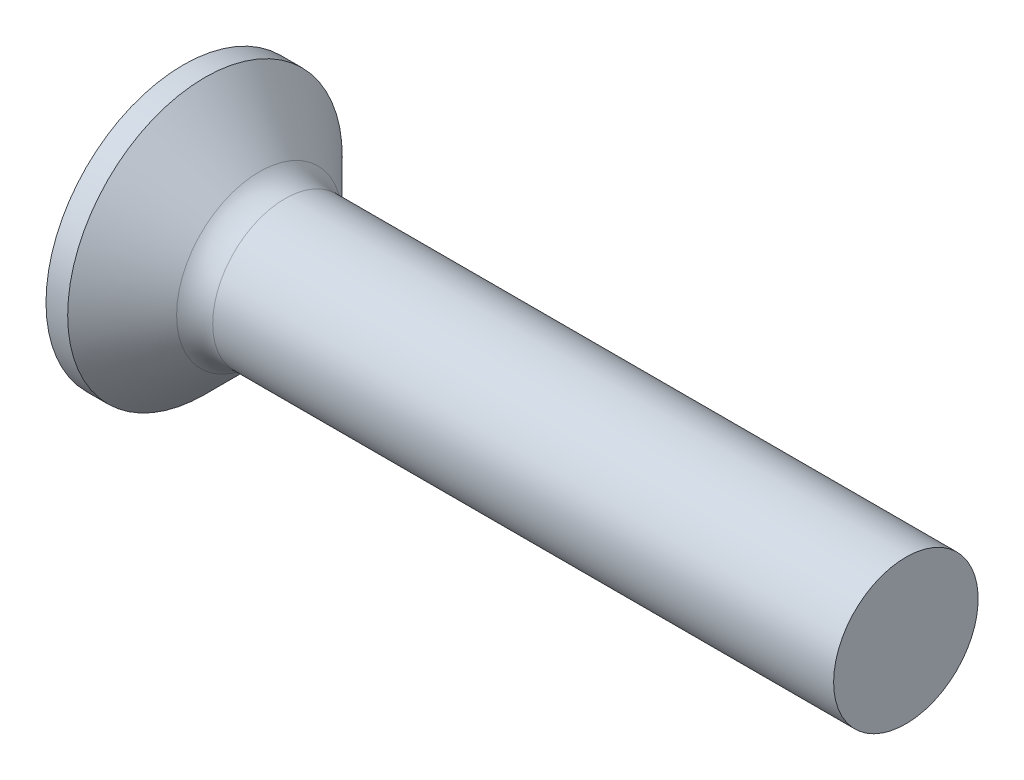
ISO-10303-21;
HEADER;
FILE_DESCRIPTION(('STEP AP214'),'2;1');
FILE_NAME('part.step','',(''),(''),'','','');
FILE_SCHEMA(('AUTOMOTIVE_DESIGN { 1 0 10303 214 1 1 1 1 }'));
ENDSEC;
DATA;
#1=APPLICATION_CONTEXT('core data for automotive mechanical design processes');
#2=APPLICATION_PROTOCOL_DEFINITION('international standard','automotive_design',2000,#1);
#3=PRODUCT_CONTEXT('',#1,'mechanical');
#4=PRODUCT('Part','Part','',(#3));
#5=PRODUCT_RELATED_PRODUCT_CATEGORY('part','',(#4));
#6=PRODUCT_DEFINITION_FORMATION('','',#4);
#7=PRODUCT_DEFINITION_CONTEXT('part definition',#1,'design');
#8=PRODUCT_DEFINITION('design','',#6,#7);
#9=PRODUCT_DEFINITION_SHAPE('','',#8);
#10=(LENGTH_UNIT() NAMED_UNIT(*) SI_UNIT(.MILLI.,.METRE.));
#11=(NAMED_UNIT(*) PLANE_ANGLE_UNIT() SI_UNIT($,.RADIAN.));
#12=(NAMED_UNIT(*) SI_UNIT($,.STERADIAN.) SOLID_ANGLE_UNIT());
#13=UNCERTAINTY_MEASURE_WITH_UNIT(LENGTH_MEASURE(1.E-05),#10,'distance_accuracy_value','');
#14=(GEOMETRIC_REPRESENTATION_CONTEXT(3) GLOBAL_UNCERTAINTY_ASSIGNED_CONTEXT((#13)) GLOBAL_UNIT_ASSIGNED_CONTEXT((#10,
#11,#12)) REPRESENTATION_CONTEXT('',''));
#15=CARTESIAN_POINT('',(0.,0.,0.));
#16=DIRECTION('',(0.,0.,1.));
#17=DIRECTION('',(1.,0.,0.));
#18=AXIS2_PLACEMENT_3D('',#15,#16,#17);
#19=CARTESIAN_POINT('',(0.,0.,0.));
#20=DIRECTION('',(-1.,0.,0.));
#21=DIRECTION('',(0.,0.,1.));
#22=AXIS2_PLACEMENT_3D('',#19,#20,#21);
#23=PLANE('',#22);
#24=CARTESIAN_POINT('',(0.,0.,0.));
#25=DIRECTION('',(-1.,0.,0.));
#26=DIRECTION('',(0.,0.,1.));
#27=AXIS2_PLACEMENT_3D('',#24,#25,#26);
#28=CIRCLE('',#27,1.9);
#29=CARTESIAN_POINT('',(0.,0.,1.9));
#30=VERTEX_POINT('',#29);
#31=EDGE_CURVE('E342',#30,#30,#28,.T.);
#32=ORIENTED_EDGE('',*,*,#31,.T.);
#33=EDGE_LOOP('',(#32));
#34=FACE_BOUND('',#33,.T.);
#35=DIRECTION('',(0.,0.,-1.));
#36=VECTOR('',#35,1.);
#37=CARTESIAN_POINT('',(0.,-0.240000000000003,0.949999999999999));
#38=LINE('',#37,#36);
#39=CARTESIAN_POINT('',(0.,-0.240000000000003,0.949999999999999));
#40=VERTEX_POINT('',#39);
#41=CARTESIAN_POINT('',(0.,-0.240000000000001,0.368080234393745));
#42=VERTEX_POINT('',#41);
#43=EDGE_CURVE('E381',#40,#42,#38,.T.);
#44=ORIENTED_EDGE('',*,*,#43,.T.);
#45=CARTESIAN_POINT('',(0.,0.,0.));
#46=DIRECTION('',(-1.,0.,0.));
#47=DIRECTION('',(0.,0.,1.));
#48=AXIS2_PLACEMENT_3D('',#45,#46,#47);
#49=CIRCLE('',#48,0.439412174332203);
#50=CARTESIAN_POINT('',(0.,-0.368080234393745,0.24));
#51=VERTEX_POINT('',#50);
#52=EDGE_CURVE('E368',#51,#42,#49,.T.);
#53=ORIENTED_EDGE('',*,*,#52,.F.);
#54=DIRECTION('',(0.,-1.,0.));
#55=VECTOR('',#54,1.);
#56=CARTESIAN_POINT('',(0.,0.95,0.24));
#57=LINE('',#56,#55);
#58=CARTESIAN_POINT('',(0.,-0.95,0.24));
#59=VERTEX_POINT('',#58);
#60=EDGE_CURVE('E428',#51,#59,#57,.T.);
#61=ORIENTED_EDGE('',*,*,#60,.T.);
#62=DIRECTION('',(0.,0.,-1.));
#63=VECTOR('',#62,1.);
#64=CARTESIAN_POINT('',(0.,-0.95,0.24));
#65=LINE('',#64,#63);
#66=CARTESIAN_POINT('',(0.,-0.95,-0.24));
#67=VERTEX_POINT('',#66);
#68=EDGE_CURVE('E339',#59,#67,#65,.T.);
#69=ORIENTED_EDGE('',*,*,#68,.T.);
#70=DIRECTION('',(0.,1.,0.));
#71=VECTOR('',#70,1.);
#72=CARTESIAN_POINT('',(0.,-0.95,-0.24));
#73=LINE('',#72,#71);
#74=CARTESIAN_POINT('',(0.,-0.368080234393745,-0.24));
#75=VERTEX_POINT('',#74);
#76=EDGE_CURVE('E429',#67,#75,#73,.T.);
#77=ORIENTED_EDGE('',*,*,#76,.T.);
#78=CARTESIAN_POINT('',(0.,-0.239999999999999,-0.368080234393746));
#79=VERTEX_POINT('',#78);
#80=EDGE_CURVE('E374',#79,#75,#49,.T.);
#81=ORIENTED_EDGE('',*,*,#80,.F.);
#82=CARTESIAN_POINT('',(0.,-0.239999999999997,-0.950000000000001));
#83=VERTEX_POINT('',#82);
#84=EDGE_CURVE('E390',#79,#83,#38,.T.);
#85=ORIENTED_EDGE('',*,*,#84,.T.);
#86=DIRECTION('',(0.,1.,0.));
#87=VECTOR('',#86,1.);
#88=CARTESIAN_POINT('',(0.,-0.239999999999997,-0.950000000000001));
#89=LINE('',#88,#87);
#90=CARTESIAN_POINT('',(0.,0.240000000000003,-0.949999999999999));
#91=VERTEX_POINT('',#90);
#92=EDGE_CURVE('E389',#83,#91,#89,.T.);
#93=ORIENTED_EDGE('',*,*,#92,.T.);
#94=DIRECTION('',(0.,0.,1.));
#95=VECTOR('',#94,1.);
#96=CARTESIAN_POINT('',(0.,0.240000000000003,-0.949999999999999));
#97=LINE('',#96,#95);
#98=CARTESIAN_POINT('',(0.,0.240000000000001,-0.368080234393745));
#99=VERTEX_POINT('',#98);
#100=EDGE_CURVE('E396',#91,#99,#97,.T.);
#101=ORIENTED_EDGE('',*,*,#100,.T.);
#102=CARTESIAN_POINT('',(0.,0.368080234393745,-0.24));
#103=VERTEX_POINT('',#102);
#104=EDGE_CURVE('E464',#103,#99,#49,.T.);
#105=ORIENTED_EDGE('',*,*,#104,.F.);
#106=CARTESIAN_POINT('',(0.,0.95,-0.24));
#107=VERTEX_POINT('',#106);
#108=EDGE_CURVE('E437',#103,#107,#73,.T.);
#109=ORIENTED_EDGE('',*,*,#108,.T.);
#110=DIRECTION('',(0.,0.,1.));
#111=VECTOR('',#110,1.);
#112=CARTESIAN_POINT('',(0.,0.95,-0.24));
#113=LINE('',#112,#111);
#114=CARTESIAN_POINT('',(0.,0.95,0.24));
#115=VERTEX_POINT('',#114);
#116=EDGE_CURVE('E425',#107,#115,#113,.T.);
#117=ORIENTED_EDGE('',*,*,#116,.T.);
#118=CARTESIAN_POINT('',(0.,0.368080234393745,0.24));
#119=VERTEX_POINT('',#118);
#120=EDGE_CURVE('E430',#115,#119,#57,.T.);
#121=ORIENTED_EDGE('',*,*,#120,.T.);
#122=CARTESIAN_POINT('',(0.,0.239999999999999,0.368080234393746));
#123=VERTEX_POINT('',#122);
#124=EDGE_CURVE('E376',#123,#119,#49,.T.);
#125=ORIENTED_EDGE('',*,*,#124,.F.);
#126=CARTESIAN_POINT('',(0.,0.239999999999997,0.950000000000001));
#127=VERTEX_POINT('',#126);
#128=EDGE_CURVE('E399',#123,#127,#97,.T.);
#129=ORIENTED_EDGE('',*,*,#128,.T.);
#130=DIRECTION('',(0.,-1.,0.));
#131=VECTOR('',#130,1.);
#132=CARTESIAN_POINT('',(0.,0.239999999999997,0.950000000000001));
#133=LINE('',#132,#131);
#134=EDGE_CURVE('E388',#127,#40,#133,.T.);
#135=ORIENTED_EDGE('',*,*,#134,.T.);
#136=EDGE_LOOP('',(#44,#53,#61,#69,#77,#81,#85,#93,#101,#105,#109,#117,#121,#125,#129,#135));
#137=FACE_BOUND('',#136,.T.);
#138=ADVANCED_FACE('F35',(#34,#137),#23,.T.);
#139=CARTESIAN_POINT('',(0.,-0.949999999999999,0.24));
#140=DIRECTION('',(0.,0.,-1.));
#141=DIRECTION('',(0.,1.,0.));
#142=AXIS2_PLACEMENT_3D('',#139,#140,#141);
#143=PLANE('',#142);
#144=ORIENTED_EDGE('',*,*,#60,.F.);
#145=CARTESIAN_POINT('',(-0.647693210421638,-0.421114336989891,0.24));
#146=CARTESIAN_POINT('',(-0.514503449539821,-0.410390261082994,0.24));
#147=CARTESIAN_POINT('',(-0.381320940230654,-0.399574318210381,0.24));
#148=CARTESIAN_POINT('',(-0.114973765657541,-0.377686644384344,0.24));
#149=CARTESIAN_POINT('',(0.0181908991048064,-0.366614907333785,0.24));
#150=CARTESIAN_POINT('',(0.284492634007954,-0.344144100394554,0.24));
#151=CARTESIAN_POINT('',(0.417629704159725,-0.332745030636282,0.24));
#152=CARTESIAN_POINT('',(0.683863247577946,-0.309504122508032,0.24));
#153=CARTESIAN_POINT('',(0.816959721458451,-0.297662291208049,0.24));
#154=CARTESIAN_POINT('',(1.04303435438055,-0.277010154534468,0.24));
#155=CARTESIAN_POINT('',(1.13602713245196,-0.268360479226193,0.24));
#156=CARTESIAN_POINT('',(1.32197255819723,-0.250648380041589,0.24));
#157=CARTESIAN_POINT('',(1.41492520622595,-0.241585959893612,0.24));
#158=CARTESIAN_POINT('',(1.60078125425266,-0.222904447218474,0.24));
#159=CARTESIAN_POINT('',(1.69368465086432,-0.213285320435301,0.24));
#160=CARTESIAN_POINT('',(1.87939874419459,-0.193166747195666,0.24));
#161=CARTESIAN_POINT('',(1.97220943766423,-0.182667270910302,0.24));
#162=CARTESIAN_POINT('',(2.0649517678624,-0.171565852393332,0.24));
#163=B_SPLINE_CURVE_WITH_KNOTS('',3,(#145,#146,#147,#148,#149,#150,#151,#152,#153,#154,#155,
#156,#157,#158,#159,#160,#161,#162),.UNSPECIFIED.,.F.,.F.,(4,2,2,2,2,2,2,2,4),(0.,
0.400862588724007,0.801734742325294,1.2026067362345,1.60347233177046,1.88365413960954,
2.16383341704974,2.44402995322111,2.72423598713696),.UNSPECIFIED.);
#164=CARTESIAN_POINT('',(1.2,-0.262259890185288,0.240000000000001));
#165=VERTEX_POINT('',#164);
#166=EDGE_CURVE('E371',#51,#165,#163,.T.);
#167=ORIENTED_EDGE('',*,*,#166,.T.);
#168=DIRECTION('',(0.,-1.,0.));
#169=VECTOR('',#168,1.);
#170=CARTESIAN_POINT('',(1.2,0.351702090980209,0.24));
#171=LINE('',#170,#169);
#172=CARTESIAN_POINT('',(1.2,-0.351702090980209,0.24));
#173=VERTEX_POINT('',#172);
#174=EDGE_CURVE('E444',#165,#173,#171,.T.);
#175=ORIENTED_EDGE('',*,*,#174,.T.);
#176=DIRECTION('',(0.89493436774996,0.446197800778958,0.));
#177=VECTOR('',#176,1.);
#178=CARTESIAN_POINT('',(0.,-0.95,0.24));
#179=LINE('',#178,#177);
#180=EDGE_CURVE('E317',#59,#173,#179,.T.);
#181=ORIENTED_EDGE('',*,*,#180,.F.);
#182=EDGE_LOOP('',(#144,#167,#175,#181));
#183=FACE_BOUND('',#182,.T.);
#184=ADVANCED_FACE('F189',(#183),#143,.T.);
#185=CARTESIAN_POINT('',(1.2,0.351702090980209,0.24));
#186=VERTEX_POINT('',#185);
#187=CARTESIAN_POINT('',(1.2,0.262259890185288,0.24));
#188=VERTEX_POINT('',#187);
#189=EDGE_CURVE('E326',#186,#188,#171,.T.);
#190=ORIENTED_EDGE('',*,*,#189,.T.);
#191=CARTESIAN_POINT('',(-0.647693210421638,0.421114336989891,0.24));
#192=CARTESIAN_POINT('',(-0.514503449539821,0.410390261082994,0.24));
#193=CARTESIAN_POINT('',(-0.381320940230654,0.399574318210381,0.24));
#194=CARTESIAN_POINT('',(-0.114973765657541,0.377686644384344,0.24));
#195=CARTESIAN_POINT('',(0.0181908991048065,0.366614907333785,0.24));
#196=CARTESIAN_POINT('',(0.284492634007954,0.344144100394554,0.24));
#197=CARTESIAN_POINT('',(0.417629704159725,0.332745030636282,0.24));
#198=CARTESIAN_POINT('',(0.683863247577946,0.309504122508032,0.24));
#199=CARTESIAN_POINT('',(0.816959721458451,0.297662291208049,0.24));
#200=CARTESIAN_POINT('',(1.04303435438056,0.277010154534468,0.24));
#201=CARTESIAN_POINT('',(1.13602713245196,0.268360479226193,0.24));
#202=CARTESIAN_POINT('',(1.32197255819723,0.250648380041589,0.24));
#203=CARTESIAN_POINT('',(1.41492520622595,0.241585959893612,0.24));
#204=CARTESIAN_POINT('',(1.60078125425266,0.222904447218474,0.24));
#205=CARTESIAN_POINT('',(1.69368465086432,0.213285320435301,0.24));
#206=CARTESIAN_POINT('',(1.87939874419459,0.193166747195666,0.24));
#207=CARTESIAN_POINT('',(1.97220943766423,0.182667270910302,0.24));
#208=CARTESIAN_POINT('',(2.0649517678624,0.171565852393332,0.24));
#209=B_SPLINE_CURVE_WITH_KNOTS('',3,(#191,#192,#193,#194,#195,#196,#197,#198,#199,#200,#201,
#202,#203,#204,#205,#206,#207,#208),.UNSPECIFIED.,.F.,.F.,(4,2,2,2,2,2,2,2,4),(0.,
0.400862588724007,0.801734742325293,1.2026067362345,1.60347233177046,1.88365413960954,
2.16383341704974,2.44402995322111,2.72423598713696),.UNSPECIFIED.);
#210=EDGE_CURVE('E249',#188,#119,#209,.F.);
#211=ORIENTED_EDGE('',*,*,#210,.T.);
#212=ORIENTED_EDGE('',*,*,#120,.F.);
#213=DIRECTION('',(0.89493436774996,-0.446197800778958,0.));
#214=VECTOR('',#213,1.);
#215=CARTESIAN_POINT('',(0.,0.95,0.24));
#216=LINE('',#215,#214);
#217=EDGE_CURVE('E58',#115,#186,#216,.T.);
#218=ORIENTED_EDGE('',*,*,#217,.T.);
#219=EDGE_LOOP('',(#190,#211,#212,#218));
#220=FACE_BOUND('',#219,.T.);
#221=ADVANCED_FACE('F194',(#220),#143,.T.);
#222=CARTESIAN_POINT('',(0.,0.949999999999999,-0.24));
#223=DIRECTION('',(0.,0.,1.));
#224=DIRECTION('',(1.,0.,0.));
#225=AXIS2_PLACEMENT_3D('',#222,#223,#224);
#226=PLANE('',#225);
#227=DIRECTION('',(0.,1.,0.));
#228=VECTOR('',#227,1.);
#229=CARTESIAN_POINT('',(1.2,-0.351702090980209,-0.24));
#230=LINE('',#229,#228);
#231=CARTESIAN_POINT('',(1.2,-0.351702090980209,-0.24));
#232=VERTEX_POINT('',#231);
#233=CARTESIAN_POINT('',(1.2,-0.262259890185288,-0.24));
#234=VERTEX_POINT('',#233);
#235=EDGE_CURVE('E330',#232,#234,#230,.T.);
#236=ORIENTED_EDGE('',*,*,#235,.T.);
#237=CARTESIAN_POINT('',(-0.647693210421638,-0.421114336989891,-0.24));
#238=CARTESIAN_POINT('',(-0.514503449539821,-0.410390261082994,-0.24));
#239=CARTESIAN_POINT('',(-0.381320940230654,-0.399574318210381,-0.24));
#240=CARTESIAN_POINT('',(-0.114973765657541,-0.377686644384344,-0.24));
#241=CARTESIAN_POINT('',(0.0181908991048066,-0.366614907333785,-0.24));
#242=CARTESIAN_POINT('',(0.284492634007954,-0.344144100394554,-0.24));
#243=CARTESIAN_POINT('',(0.417629704159725,-0.332745030636282,-0.24));
#244=CARTESIAN_POINT('',(0.683863247577946,-0.309504122508032,-0.24));
#245=CARTESIAN_POINT('',(0.816959721458451,-0.297662291208049,-0.24));
#246=CARTESIAN_POINT('',(1.04303435438056,-0.277010154534468,-0.24));
#247=CARTESIAN_POINT('',(1.13602713245196,-0.268360479226193,-0.24));
#248=CARTESIAN_POINT('',(1.32197255819723,-0.250648380041589,-0.24));
#249=CARTESIAN_POINT('',(1.41492520622595,-0.241585959893612,-0.24));
#250=CARTESIAN_POINT('',(1.60078125425266,-0.222904447218474,-0.24));
#251=CARTESIAN_POINT('',(1.69368465086432,-0.213285320435301,-0.24));
#252=CARTESIAN_POINT('',(1.87939874419459,-0.193166747195666,-0.24));
#253=CARTESIAN_POINT('',(1.97220943766423,-0.182667270910302,-0.24));
#254=CARTESIAN_POINT('',(2.0649517678624,-0.171565852393332,-0.24));
#255=B_SPLINE_CURVE_WITH_KNOTS('',3,(#237,#238,#239,#240,#241,#242,#243,#244,#245,#246,#247,
#248,#249,#250,#251,#252,#253,#254),.UNSPECIFIED.,.F.,.F.,(4,2,2,2,2,2,2,2,4),(0.,
0.400862588724007,0.801734742325294,1.2026067362345,1.60347233177046,1.88365413960954,
2.16383341704974,2.44402995322111,2.72423598713696),.UNSPECIFIED.);
#256=EDGE_CURVE('E243',#234,#75,#255,.F.);
#257=ORIENTED_EDGE('',*,*,#256,.T.);
#258=ORIENTED_EDGE('',*,*,#76,.F.);
#259=DIRECTION('',(0.89493436774996,0.446197800778958,0.));
#260=VECTOR('',#259,1.);
#261=CARTESIAN_POINT('',(0.,-0.95,-0.24));
#262=LINE('',#261,#260);
#263=EDGE_CURVE('E439',#67,#232,#262,.T.);
#264=ORIENTED_EDGE('',*,*,#263,.T.);
#265=EDGE_LOOP('',(#236,#257,#258,#264));
#266=FACE_BOUND('',#265,.T.);
#267=ADVANCED_FACE('F229',(#266),#226,.T.);
#268=ORIENTED_EDGE('',*,*,#108,.F.);
#269=CARTESIAN_POINT('',(-0.647693210410767,0.421114336989016,-0.24));
#270=CARTESIAN_POINT('',(-0.514503449530112,0.410390261082207,-0.24));
#271=CARTESIAN_POINT('',(-0.381320940222106,0.399574318209684,-0.24));
#272=CARTESIAN_POINT('',(-0.114973765651316,0.377686644383828,-0.24));
#273=CARTESIAN_POINT('',(0.0181908991098697,0.366614907333361,-0.24));
#274=CARTESIAN_POINT('',(0.284492634009302,0.344144100394437,-0.24));
#275=CARTESIAN_POINT('',(0.417629704158519,0.332745030636383,-0.24));
#276=CARTESIAN_POINT('',(0.683863247571635,0.309504122508587,-0.24));
#277=CARTESIAN_POINT('',(0.816959721449588,0.29766229120884,-0.24));
#278=CARTESIAN_POINT('',(1.04303435436914,0.277010154535523,-0.24));
#279=CARTESIAN_POINT('',(1.13602713244054,0.268360479227263,-0.24));
#280=CARTESIAN_POINT('',(1.32197255818582,0.250648380042693,-0.24));
#281=CARTESIAN_POINT('',(1.41492520621454,0.241585959894735,-0.24));
#282=CARTESIAN_POINT('',(1.60078125424125,0.222904447219644,-0.24));
#283=CARTESIAN_POINT('',(1.69368465085292,0.213285320436499,-0.24));
#284=CARTESIAN_POINT('',(1.8793987441832,0.193166747196935,-0.24));
#285=CARTESIAN_POINT('',(1.97220943765284,0.182667270911615,-0.24));
#286=CARTESIAN_POINT('',(2.06495176785102,0.171565852394701,-0.24));
#287=B_SPLINE_CURVE_WITH_KNOTS('',3,(#269,#270,#271,#272,#273,#274,#275,#276,#277,#278,#279,
#280,#281,#282,#283,#284,#285,#286),.UNSPECIFIED.,.F.,.F.,(4,2,2,2,2,2,2,2,4),(0.,
0.400862588720512,0.801734742318303,1.20260673621982,1.60347233174809,1.88365413958718,
2.16383341702737,2.44402995319874,2.72423598711459),.UNSPECIFIED.);
#288=CARTESIAN_POINT('',(1.2,0.262259890185288,-0.24));
#289=VERTEX_POINT('',#288);
#290=EDGE_CURVE('E237',#103,#289,#287,.T.);
#291=ORIENTED_EDGE('',*,*,#290,.T.);
#292=CARTESIAN_POINT('',(1.2,0.351702090980209,-0.24));
#293=VERTEX_POINT('',#292);
#294=EDGE_CURVE('E334',#289,#293,#230,.T.);
#295=ORIENTED_EDGE('',*,*,#294,.T.);
#296=DIRECTION('',(0.89493436774996,-0.446197800778958,0.));
#297=VECTOR('',#296,1.);
#298=CARTESIAN_POINT('',(0.,0.95,-0.24));
#299=LINE('',#298,#297);
#300=EDGE_CURVE('E321',#107,#293,#299,.T.);
#301=ORIENTED_EDGE('',*,*,#300,.F.);
#302=EDGE_LOOP('',(#268,#291,#295,#301));
#303=FACE_BOUND('',#302,.T.);
#304=ADVANCED_FACE('F221',(#303),#226,.T.);
#305=CARTESIAN_POINT('',(1.2,0.351702090980209,-0.24));
#306=DIRECTION('',(1.,0.,0.));
#307=DIRECTION('',(0.,0.,-1.));
#308=AXIS2_PLACEMENT_3D('',#305,#306,#307);
#309=PLANE('',#308);
#310=CARTESIAN_POINT('',(1.2,0.,0.));
#311=DIRECTION('',(-1.,0.,0.));
#312=DIRECTION('',(0.,0.,1.));
#313=AXIS2_PLACEMENT_3D('',#310,#311,#312);
#314=CIRCLE('',#313,0.355499999999999);
#315=CARTESIAN_POINT('',(1.2,-0.051825565121357,-0.351702090980209));
#316=VERTEX_POINT('',#315);
#317=CARTESIAN_POINT('',(1.2,-0.239999999999999,-0.262259890185289));
#318=VERTEX_POINT('',#317);
#319=EDGE_CURVE('E511',#316,#318,#314,.T.);
#320=ORIENTED_EDGE('',*,*,#319,.F.);
#321=DIRECTION('',(0.,1.,0.));
#322=VECTOR('',#321,1.);
#323=CARTESIAN_POINT('',(1.2,-0.239999999999999,-0.35170209098021));
#324=LINE('',#323,#322);
#325=CARTESIAN_POINT('',(1.2,-0.239999999999999,-0.35170209098021));
#326=VERTEX_POINT('',#325);
#327=EDGE_CURVE('E411',#326,#316,#324,.T.);
#328=ORIENTED_EDGE('',*,*,#327,.F.);
#329=DIRECTION('',(0.,0.,-1.));
#330=VECTOR('',#329,1.);
#331=CARTESIAN_POINT('',(1.2,-0.240000000000001,0.351702090980209));
#332=LINE('',#331,#330);
#333=EDGE_CURVE('E415',#318,#326,#332,.T.);
#334=ORIENTED_EDGE('',*,*,#333,.F.);
#335=EDGE_LOOP('',(#320,#328,#334));
#336=FACE_BOUND('',#335,.T.);
#337=ADVANCED_FACE('F217',(#336),#309,.F.);
#338=CARTESIAN_POINT('',(1.2,-0.351702090980209,-0.0518255651213578));
#339=VERTEX_POINT('',#338);
#340=EDGE_CURVE('E482',#234,#339,#314,.T.);
#341=ORIENTED_EDGE('',*,*,#340,.F.);
#342=ORIENTED_EDGE('',*,*,#235,.F.);
#343=DIRECTION('',(0.,0.,-1.));
#344=VECTOR('',#343,1.);
#345=CARTESIAN_POINT('',(1.2,-0.351702090980209,0.24));
#346=LINE('',#345,#344);
#347=EDGE_CURVE('E322',#339,#232,#346,.T.);
#348=ORIENTED_EDGE('',*,*,#347,.F.);
#349=EDGE_LOOP('',(#341,#342,#348));
#350=FACE_BOUND('',#349,.T.);
#351=ADVANCED_FACE('F220',(#350),#309,.F.);
#352=CARTESIAN_POINT('',(1.2,-0.351702090980209,0.051825565121358));
#353=VERTEX_POINT('',#352);
#354=EDGE_CURVE('E478',#353,#165,#314,.T.);
#355=ORIENTED_EDGE('',*,*,#354,.F.);
#356=EDGE_CURVE('E312',#173,#353,#346,.T.);
#357=ORIENTED_EDGE('',*,*,#356,.F.);
#358=ORIENTED_EDGE('',*,*,#174,.F.);
#359=EDGE_LOOP('',(#355,#357,#358));
#360=FACE_BOUND('',#359,.T.);
#361=ADVANCED_FACE('F476',(#360),#309,.F.);
#362=CARTESIAN_POINT('',(1.2,-0.240000000000001,0.262259890185288));
#363=VERTEX_POINT('',#362);
#364=CARTESIAN_POINT('',(1.2,-0.0518255651213537,0.351702090980209));
#365=VERTEX_POINT('',#364);
#366=EDGE_CURVE('E50',#363,#365,#314,.T.);
#367=ORIENTED_EDGE('',*,*,#366,.F.);
#368=CARTESIAN_POINT('',(1.2,-0.240000000000001,0.351702090980209));
#369=VERTEX_POINT('',#368);
#370=EDGE_CURVE('E384',#369,#363,#332,.T.);
#371=ORIENTED_EDGE('',*,*,#370,.F.);
#372=DIRECTION('',(0.,-1.,0.));
#373=VECTOR('',#372,1.);
#374=CARTESIAN_POINT('',(1.2,0.239999999999999,0.35170209098021));
#375=LINE('',#374,#373);
#376=EDGE_CURVE('E416',#365,#369,#375,.T.);
#377=ORIENTED_EDGE('',*,*,#376,.F.);
#378=EDGE_LOOP('',(#367,#371,#377));
#379=FACE_BOUND('',#378,.T.);
#380=ADVANCED_FACE('F522',(#379),#309,.F.);
#381=CARTESIAN_POINT('',(1.2,0.0518255651213568,0.35170209098021));
#382=VERTEX_POINT('',#381);
#383=CARTESIAN_POINT('',(1.2,0.239999999999999,0.262259890185289));
#384=VERTEX_POINT('',#383);
#385=EDGE_CURVE('E375',#382,#384,#314,.T.);
#386=ORIENTED_EDGE('',*,*,#385,.F.);
#387=CARTESIAN_POINT('',(1.2,0.239999999999999,0.35170209098021));
#388=VERTEX_POINT('',#387);
#389=EDGE_CURVE('E412',#388,#382,#375,.T.);
#390=ORIENTED_EDGE('',*,*,#389,.F.);
#391=DIRECTION('',(0.,0.,1.));
#392=VECTOR('',#391,1.);
#393=CARTESIAN_POINT('',(1.2,0.240000000000001,-0.351702090980209));
#394=LINE('',#393,#392);
#395=EDGE_CURVE('E424',#384,#388,#394,.T.);
#396=ORIENTED_EDGE('',*,*,#395,.F.);
#397=EDGE_LOOP('',(#386,#390,#396));
#398=FACE_BOUND('',#397,.T.);
#399=ADVANCED_FACE('F487',(#398),#309,.F.);
#400=CARTESIAN_POINT('',(1.2,0.351702090980209,0.0518255651213573));
#401=VERTEX_POINT('',#400);
#402=EDGE_CURVE('E456',#188,#401,#314,.T.);
#403=ORIENTED_EDGE('',*,*,#402,.F.);
#404=ORIENTED_EDGE('',*,*,#189,.F.);
#405=DIRECTION('',(0.,0.,1.));
#406=VECTOR('',#405,1.);
#407=CARTESIAN_POINT('',(1.2,0.351702090980209,-0.24));
#408=LINE('',#407,#406);
#409=EDGE_CURVE('E333',#401,#186,#408,.T.);
#410=ORIENTED_EDGE('',*,*,#409,.F.);
#411=EDGE_LOOP('',(#403,#404,#410));
#412=FACE_BOUND('',#411,.T.);
#413=ADVANCED_FACE('F454',(#412),#309,.F.);
#414=CARTESIAN_POINT('',(1.2,0.351702090980209,-0.0518255651213575));
#415=VERTEX_POINT('',#414);
#416=EDGE_CURVE('E462',#415,#289,#314,.T.);
#417=ORIENTED_EDGE('',*,*,#416,.F.);
#418=EDGE_CURVE('E442',#293,#415,#408,.T.);
#419=ORIENTED_EDGE('',*,*,#418,.F.);
#420=ORIENTED_EDGE('',*,*,#294,.F.);
#421=EDGE_LOOP('',(#417,#419,#420));
#422=FACE_BOUND('',#421,.T.);
#423=ADVANCED_FACE('F306',(#422),#309,.F.);
#424=CARTESIAN_POINT('',(1.2,0.240000000000001,-0.262259890185288));
#425=VERTEX_POINT('',#424);
#426=CARTESIAN_POINT('',(1.2,0.0518255651213593,-0.351702090980209));
#427=VERTEX_POINT('',#426);
#428=EDGE_CURVE('E505',#425,#427,#314,.T.);
#429=ORIENTED_EDGE('',*,*,#428,.F.);
#430=CARTESIAN_POINT('',(1.2,0.240000000000001,-0.351702090980209));
#431=VERTEX_POINT('',#430);
#432=EDGE_CURVE('E421',#431,#425,#394,.T.);
#433=ORIENTED_EDGE('',*,*,#432,.F.);
#434=EDGE_CURVE('E418',#427,#431,#324,.T.);
#435=ORIENTED_EDGE('',*,*,#434,.F.);
#436=EDGE_LOOP('',(#429,#433,#435));
#437=FACE_BOUND('',#436,.T.);
#438=ADVANCED_FACE('F223',(#437),#309,.F.);
#439=CARTESIAN_POINT('',(0.,-0.95,-0.24));
#440=DIRECTION('',(-0.446197800778958,0.89493436774996,0.));
#441=DIRECTION('',(-0.89493436774996,-0.446197800778958,0.));
#442=AXIS2_PLACEMENT_3D('',#439,#440,#441);
#443=PLANE('',#442);
#444=ORIENTED_EDGE('',*,*,#356,.T.);
#445=CARTESIAN_POINT('',(1.81755030037573,-0.0438028797890924,0.));
#446=DIRECTION('',(-0.446197800778958,0.89493436774996,0.));
#447=DIRECTION('',(-0.89493436774996,-0.446197800778958,0.));
#448=AXIS2_PLACEMENT_3D('',#445,#446,#447);
#449=ELLIPSE('',#448,0.699951178008363,0.309229710740659);
#450=EDGE_CURVE('E313',#353,#339,#449,.F.);
#451=ORIENTED_EDGE('',*,*,#450,.T.);
#452=ORIENTED_EDGE('',*,*,#347,.T.);
#453=ORIENTED_EDGE('',*,*,#263,.F.);
#454=ORIENTED_EDGE('',*,*,#68,.F.);
#455=ORIENTED_EDGE('',*,*,#180,.T.);
#456=EDGE_LOOP('',(#444,#451,#452,#453,#454,#455));
#457=FACE_BOUND('',#456,.T.);
#458=ADVANCED_FACE('F228',(#457),#443,.T.);
#459=CARTESIAN_POINT('',(0.,0.95,0.24));
#460=DIRECTION('',(-0.446197800778958,-0.89493436774996,0.));
#461=DIRECTION('',(0.89493436774996,-0.446197800778958,0.));
#462=AXIS2_PLACEMENT_3D('',#459,#460,#461);
#463=PLANE('',#462);
#464=ORIENTED_EDGE('',*,*,#418,.T.);
#465=CARTESIAN_POINT('',(1.81755030037572,0.0438028797890928,0.));
#466=DIRECTION('',(-0.446197800778958,-0.89493436774996,0.));
#467=DIRECTION('',(-0.89493436774996,0.446197800778958,0.));
#468=AXIS2_PLACEMENT_3D('',#465,#466,#467);
#469=ELLIPSE('',#468,0.699951178008362,0.309229710740658);
#470=EDGE_CURVE('E290',#415,#401,#469,.F.);
#471=ORIENTED_EDGE('',*,*,#470,.T.);
#472=ORIENTED_EDGE('',*,*,#409,.T.);
#473=ORIENTED_EDGE('',*,*,#217,.F.);
#474=ORIENTED_EDGE('',*,*,#116,.F.);
#475=ORIENTED_EDGE('',*,*,#300,.T.);
#476=EDGE_LOOP('',(#464,#471,#472,#473,#474,#475));
#477=FACE_BOUND('',#476,.T.);
#478=ADVANCED_FACE('F224',(#477),#463,.T.);
#479=CARTESIAN_POINT('',(0.,0.239999999999997,0.95));
#480=DIRECTION('',(0.,-1.,0.));
#481=DIRECTION('',(1.,0.,0.));
#482=AXIS2_PLACEMENT_3D('',#479,#480,#481);
#483=PLANE('',#482);
#484=ORIENTED_EDGE('',*,*,#432,.T.);
#485=CARTESIAN_POINT('',(-0.647693210421638,0.240000000000001,-0.42111433698989));
#486=CARTESIAN_POINT('',(-0.514503449539822,0.240000000000001,-0.410390261082993));
#487=CARTESIAN_POINT('',(-0.381320940230654,0.240000000000001,-0.399574318210381));
#488=CARTESIAN_POINT('',(-0.114973765657541,0.240000000000001,-0.377686644384343));
#489=CARTESIAN_POINT('',(0.0181908991048064,0.240000000000001,-0.366614907333784));
#490=CARTESIAN_POINT('',(0.284492634007954,0.240000000000001,-0.344144100394553));
#491=CARTESIAN_POINT('',(0.417629704159725,0.240000000000001,-0.332745030636281));
#492=CARTESIAN_POINT('',(0.683863247577946,0.240000000000001,-0.309504122508031));
#493=CARTESIAN_POINT('',(0.816959721458451,0.240000000000001,-0.297662291208048));
#494=CARTESIAN_POINT('',(1.04303435438056,0.240000000000001,-0.277010154534467));
#495=CARTESIAN_POINT('',(1.13602713245196,0.240000000000001,-0.268360479226192));
#496=CARTESIAN_POINT('',(1.32197255819723,0.240000000000001,-0.250648380041589));
#497=CARTESIAN_POINT('',(1.41492520622595,0.240000000000001,-0.241585959893611));
#498=CARTESIAN_POINT('',(1.60078125425266,0.240000000000001,-0.222904447218473));
#499=CARTESIAN_POINT('',(1.69368465086432,0.240000000000001,-0.213285320435301));
#500=CARTESIAN_POINT('',(1.87939874419459,0.240000000000001,-0.193166747195665));
#501=CARTESIAN_POINT('',(1.97220943766423,0.240000000000001,-0.182667270910301));
#502=CARTESIAN_POINT('',(2.0649517678624,0.240000000000001,-0.171565852393331));
#503=B_SPLINE_CURVE_WITH_KNOTS('',3,(#485,#486,#487,#488,#489,#490,#491,#492,#493,#494,#495,
#496,#497,#498,#499,#500,#501,#502),.UNSPECIFIED.,.F.,.F.,(4,2,2,2,2,2,2,2,4),(0.,
0.400862588724007,0.801734742325294,1.2026067362345,1.60347233177046,1.88365413960954,
2.16383341704974,2.44402995322111,2.72423598713696),.UNSPECIFIED.);
#504=EDGE_CURVE('E283',#425,#99,#503,.F.);
#505=ORIENTED_EDGE('',*,*,#504,.T.);
#506=ORIENTED_EDGE('',*,*,#100,.F.);
#507=DIRECTION('',(0.89493436774996,0.,0.446197800778958));
#508=VECTOR('',#507,1.);
#509=CARTESIAN_POINT('',(0.,0.240000000000003,-0.949999999999999));
#510=LINE('',#509,#508);
#511=EDGE_CURVE('E403',#91,#431,#510,.T.);
#512=ORIENTED_EDGE('',*,*,#511,.T.);
#513=EDGE_LOOP('',(#484,#505,#506,#512));
#514=FACE_BOUND('',#513,.T.);
#515=ADVANCED_FACE('F227',(#514),#483,.T.);
#516=CARTESIAN_POINT('',(0.,-0.239999999999997,-0.95));
#517=DIRECTION('',(0.,1.,0.));
#518=DIRECTION('',(0.,0.,1.));
#519=AXIS2_PLACEMENT_3D('',#516,#517,#518);
#520=PLANE('',#519);
#521=ORIENTED_EDGE('',*,*,#84,.F.);
#522=CARTESIAN_POINT('',(-0.647693210410766,-0.239999999999999,-0.421114336989017));
#523=CARTESIAN_POINT('',(-0.514503449530112,-0.239999999999999,-0.410390261082208));
#524=CARTESIAN_POINT('',(-0.381320940222106,-0.239999999999999,-0.399574318209684));
#525=CARTESIAN_POINT('',(-0.114973765651316,-0.239999999999999,-0.377686644383829));
#526=CARTESIAN_POINT('',(0.0181908991098697,-0.239999999999999,-0.366614907333361));
#527=CARTESIAN_POINT('',(0.284492634009302,-0.239999999999999,-0.344144100394438));
#528=CARTESIAN_POINT('',(0.417629704158519,-0.239999999999999,-0.332745030636384));
#529=CARTESIAN_POINT('',(0.683863247571635,-0.239999999999999,-0.309504122508588));
#530=CARTESIAN_POINT('',(0.816959721449588,-0.239999999999999,-0.297662291208841));
#531=CARTESIAN_POINT('',(1.04303435436914,-0.239999999999999,-0.277010154535524));
#532=CARTESIAN_POINT('',(1.13602713244054,-0.239999999999999,-0.268360479227263));
#533=CARTESIAN_POINT('',(1.32197255818582,-0.239999999999999,-0.250648380042694));
#534=CARTESIAN_POINT('',(1.41492520621454,-0.239999999999999,-0.241585959894736));
#535=CARTESIAN_POINT('',(1.60078125424125,-0.239999999999999,-0.222904447219645));
#536=CARTESIAN_POINT('',(1.69368465085292,-0.239999999999999,-0.2132853204365));
#537=CARTESIAN_POINT('',(1.8793987441832,-0.239999999999999,-0.193166747196935));
#538=CARTESIAN_POINT('',(1.97220943765284,-0.239999999999999,-0.182667270911615));
#539=CARTESIAN_POINT('',(2.06495176785102,-0.239999999999999,-0.171565852394701));
#540=B_SPLINE_CURVE_WITH_KNOTS('',3,(#522,#523,#524,#525,#526,#527,#528,#529,#530,#531,#532,
#533,#534,#535,#536,#537,#538,#539),.UNSPECIFIED.,.F.,.F.,(4,2,2,2,2,2,2,2,4),(0.,
0.400862588720512,0.801734742318303,1.20260673621982,1.60347233174809,1.88365413958718,
2.16383341702737,2.44402995319874,2.72423598711459),.UNSPECIFIED.);
#541=EDGE_CURVE('E277',#79,#318,#540,.T.);
#542=ORIENTED_EDGE('',*,*,#541,.T.);
#543=ORIENTED_EDGE('',*,*,#333,.T.);
#544=DIRECTION('',(0.89493436774996,0.,0.446197800778958));
#545=VECTOR('',#544,1.);
#546=CARTESIAN_POINT('',(0.,-0.239999999999997,-0.950000000000001));
#547=LINE('',#546,#545);
#548=EDGE_CURVE('E400',#83,#326,#547,.T.);
#549=ORIENTED_EDGE('',*,*,#548,.F.);
#550=EDGE_LOOP('',(#521,#542,#543,#549));
#551=FACE_BOUND('',#550,.T.);
#552=ADVANCED_FACE('F294',(#551),#520,.T.);
#553=CARTESIAN_POINT('',(0.,0.240000000000003,-0.949999999999999));
#554=DIRECTION('',(-0.446197800778958,0.,0.89493436774996));
#555=DIRECTION('',(-0.89493436774996,0.,-0.446197800778958));
#556=AXIS2_PLACEMENT_3D('',#553,#554,#555);
#557=PLANE('',#556);
#558=ORIENTED_EDGE('',*,*,#327,.T.);
#559=CARTESIAN_POINT('',(1.81755030037573,0.,-0.0438028797890924));
#560=DIRECTION('',(-0.446197800778958,0.,0.89493436774996));
#561=DIRECTION('',(-0.89493436774996,0.,-0.446197800778958));
#562=AXIS2_PLACEMENT_3D('',#559,#560,#561);
#563=ELLIPSE('',#562,0.699951178008363,0.309229710740659);
#564=EDGE_CURVE('E385',#316,#427,#563,.F.);
#565=ORIENTED_EDGE('',*,*,#564,.T.);
#566=ORIENTED_EDGE('',*,*,#434,.T.);
#567=ORIENTED_EDGE('',*,*,#511,.F.);
#568=ORIENTED_EDGE('',*,*,#92,.F.);
#569=ORIENTED_EDGE('',*,*,#548,.T.);
#570=EDGE_LOOP('',(#558,#565,#566,#567,#568,#569));
#571=FACE_BOUND('',#570,.T.);
#572=ADVANCED_FACE('F256',(#571),#557,.T.);
#573=ORIENTED_EDGE('',*,*,#370,.T.);
#574=CARTESIAN_POINT('',(-0.647693210421638,-0.240000000000001,0.42111433698989));
#575=CARTESIAN_POINT('',(-0.514503449539822,-0.240000000000001,0.410390261082993));
#576=CARTESIAN_POINT('',(-0.381320940230654,-0.240000000000001,0.39957431821038));
#577=CARTESIAN_POINT('',(-0.114973765657541,-0.240000000000001,0.377686644384343));
#578=CARTESIAN_POINT('',(0.0181908991048064,-0.240000000000001,0.366614907333784));
#579=CARTESIAN_POINT('',(0.284492634007953,-0.240000000000001,0.344144100394553));
#580=CARTESIAN_POINT('',(0.417629704159725,-0.240000000000001,0.332745030636281));
#581=CARTESIAN_POINT('',(0.683863247577946,-0.240000000000001,0.309504122508031));
#582=CARTESIAN_POINT('',(0.816959721458451,-0.240000000000001,0.297662291208048));
#583=CARTESIAN_POINT('',(1.04303435438056,-0.240000000000001,0.277010154534467));
#584=CARTESIAN_POINT('',(1.13602713245196,-0.240000000000001,0.268360479226192));
#585=CARTESIAN_POINT('',(1.32197255819723,-0.240000000000001,0.250648380041589));
#586=CARTESIAN_POINT('',(1.41492520622595,-0.240000000000001,0.241585959893611));
#587=CARTESIAN_POINT('',(1.60078125425266,-0.240000000000001,0.222904447218473));
#588=CARTESIAN_POINT('',(1.69368465086432,-0.240000000000001,0.213285320435301));
#589=CARTESIAN_POINT('',(1.87939874419459,-0.240000000000001,0.193166747195665));
#590=CARTESIAN_POINT('',(1.97220943766423,-0.240000000000001,0.182667270910301));
#591=CARTESIAN_POINT('',(2.0649517678624,-0.240000000000001,0.171565852393331));
#592=B_SPLINE_CURVE_WITH_KNOTS('',3,(#574,#575,#576,#577,#578,#579,#580,#581,#582,#583,#584,
#585,#586,#587,#588,#589,#590,#591),.UNSPECIFIED.,.F.,.F.,(4,2,2,2,2,2,2,2,4),(0.,
0.400862588724007,0.801734742325293,1.2026067362345,1.60347233177046,1.88365413960955,
2.16383341704974,2.44402995322111,2.72423598713696),.UNSPECIFIED.);
#593=EDGE_CURVE('E270',#363,#42,#592,.F.);
#594=ORIENTED_EDGE('',*,*,#593,.T.);
#595=ORIENTED_EDGE('',*,*,#43,.F.);
#596=DIRECTION('',(0.89493436774996,0.,-0.446197800778958));
#597=VECTOR('',#596,1.);
#598=CARTESIAN_POINT('',(0.,-0.240000000000003,0.949999999999999));
#599=LINE('',#598,#597);
#600=EDGE_CURVE('E406',#40,#369,#599,.T.);
#601=ORIENTED_EDGE('',*,*,#600,.T.);
#602=EDGE_LOOP('',(#573,#594,#595,#601));
#603=FACE_BOUND('',#602,.T.);
#604=ADVANCED_FACE('F379',(#603),#520,.T.);
#605=ORIENTED_EDGE('',*,*,#128,.F.);
#606=CARTESIAN_POINT('',(-0.647693210421638,0.239999999999998,0.421114336989892));
#607=CARTESIAN_POINT('',(-0.514503449539821,0.239999999999998,0.410390261082995));
#608=CARTESIAN_POINT('',(-0.381320940230654,0.239999999999998,0.399574318210382));
#609=CARTESIAN_POINT('',(-0.114973765657541,0.239999999999999,0.377686644384345));
#610=CARTESIAN_POINT('',(0.0181908991048066,0.239999999999999,0.366614907333785));
#611=CARTESIAN_POINT('',(0.284492634007954,0.239999999999999,0.344144100394555));
#612=CARTESIAN_POINT('',(0.417629704159725,0.239999999999999,0.332745030636283));
#613=CARTESIAN_POINT('',(0.683863247577946,0.239999999999999,0.309504122508033));
#614=CARTESIAN_POINT('',(0.816959721458451,0.239999999999999,0.29766229120805));
#615=CARTESIAN_POINT('',(1.04303435438056,0.239999999999999,0.277010154534469));
#616=CARTESIAN_POINT('',(1.13602713245196,0.239999999999999,0.268360479226194));
#617=CARTESIAN_POINT('',(1.32197255819723,0.239999999999999,0.25064838004159));
#618=CARTESIAN_POINT('',(1.41492520622595,0.239999999999999,0.241585959893613));
#619=CARTESIAN_POINT('',(1.60078125425266,0.239999999999999,0.222904447218474));
#620=CARTESIAN_POINT('',(1.69368465086432,0.239999999999999,0.213285320435302));
#621=CARTESIAN_POINT('',(1.87939874419459,0.239999999999999,0.193166747195667));
#622=CARTESIAN_POINT('',(1.97220943766423,0.239999999999999,0.182667270910303));
#623=CARTESIAN_POINT('',(2.0649517678624,0.239999999999999,0.171565852393333));
#624=B_SPLINE_CURVE_WITH_KNOTS('',3,(#606,#607,#608,#609,#610,#611,#612,#613,#614,#615,#616,
#617,#618,#619,#620,#621,#622,#623),.UNSPECIFIED.,.F.,.F.,(4,2,2,2,2,2,2,2,4),(0.,
0.400862588724007,0.801734742325293,1.2026067362345,1.60347233177046,1.88365413960955,
2.16383341704974,2.44402995322111,2.72423598713696),.UNSPECIFIED.);
#625=EDGE_CURVE('E261',#123,#384,#624,.T.);
#626=ORIENTED_EDGE('',*,*,#625,.T.);
#627=ORIENTED_EDGE('',*,*,#395,.T.);
#628=DIRECTION('',(0.89493436774996,0.,-0.446197800778958));
#629=VECTOR('',#628,1.);
#630=CARTESIAN_POINT('',(0.,0.239999999999997,0.950000000000001));
#631=LINE('',#630,#629);
#632=EDGE_CURVE('E408',#127,#388,#631,.T.);
#633=ORIENTED_EDGE('',*,*,#632,.F.);
#634=EDGE_LOOP('',(#605,#626,#627,#633));
#635=FACE_BOUND('',#634,.T.);
#636=ADVANCED_FACE('F296',(#635),#483,.T.);
#637=CARTESIAN_POINT('',(0.,-0.240000000000003,0.949999999999999));
#638=DIRECTION('',(-0.446197800778958,0.,-0.89493436774996));
#639=DIRECTION('',(0.89493436774996,0.,-0.446197800778958));
#640=AXIS2_PLACEMENT_3D('',#637,#638,#639);
#641=PLANE('',#640);
#642=ORIENTED_EDGE('',*,*,#389,.T.);
#643=CARTESIAN_POINT('',(1.81755030037572,0.,0.0438028797890928));
#644=DIRECTION('',(-0.446197800778958,0.,-0.89493436774996));
#645=DIRECTION('',(-0.89493436774996,0.,0.446197800778958));
#646=AXIS2_PLACEMENT_3D('',#643,#644,#645);
#647=ELLIPSE('',#646,0.699951178008362,0.309229710740658);
#648=EDGE_CURVE('E11',#382,#365,#647,.F.);
#649=ORIENTED_EDGE('',*,*,#648,.T.);
#650=ORIENTED_EDGE('',*,*,#376,.T.);
#651=ORIENTED_EDGE('',*,*,#600,.F.);
#652=ORIENTED_EDGE('',*,*,#134,.F.);
#653=ORIENTED_EDGE('',*,*,#632,.T.);
#654=EDGE_LOOP('',(#642,#649,#650,#651,#652,#653));
#655=FACE_BOUND('',#654,.T.);
#656=ADVANCED_FACE('F204',(#655),#641,.T.);
#657=CARTESIAN_POINT('',(-6.34999999999999,0.,0.));
#658=DIRECTION('',(-1.,0.,0.));
#659=DIRECTION('',(0.,0.,1.));
#660=AXIS2_PLACEMENT_3D('',#657,#658,#659);
#661=CYLINDRICAL_SURFACE('',#660,1.9);
#662=CARTESIAN_POINT('',(0.300000000000003,0.,0.));
#663=DIRECTION('',(-1.,0.,0.));
#664=DIRECTION('',(0.,0.,1.));
#665=AXIS2_PLACEMENT_3D('',#662,#663,#664);
#666=CIRCLE('',#665,1.9);
#667=CARTESIAN_POINT('',(0.300000000000003,0.,1.9));
#668=VERTEX_POINT('',#667);
#669=EDGE_CURVE('E338',#668,#668,#666,.T.);
#670=ORIENTED_EDGE('',*,*,#669,.T.);
#671=EDGE_LOOP('',(#670));
#672=FACE_BOUND('',#671,.T.);
#673=ORIENTED_EDGE('',*,*,#31,.F.);
#674=EDGE_LOOP('',(#673));
#675=FACE_BOUND('',#674,.T.);
#676=ADVANCED_FACE('F200',(#672,#675),#661,.T.);
#677=CARTESIAN_POINT('',(0.300000000000003,0.,0.));
#678=DIRECTION('',(-1.,0.,0.));
#679=DIRECTION('',(0.,0.,1.));
#680=AXIS2_PLACEMENT_3D('',#677,#678,#679);
#681=CONICAL_SURFACE('',#680,1.9,0.78539816339745);
#682=CARTESIAN_POINT('',(1.05355339059327,0.,0.));
#683=DIRECTION('',(-1.,0.,0.));
#684=DIRECTION('',(0.,0.,1.));
#685=AXIS2_PLACEMENT_3D('',#682,#683,#684);
#686=CIRCLE('',#685,1.14644660940673);
#687=CARTESIAN_POINT('',(1.05355339059327,0.,1.14644660940673));
#688=VERTEX_POINT('',#687);
#689=EDGE_CURVE('E344',#688,#688,#686,.T.);
#690=ORIENTED_EDGE('',*,*,#689,.T.);
#691=EDGE_LOOP('',(#690));
#692=FACE_BOUND('',#691,.T.);
#693=ORIENTED_EDGE('',*,*,#669,.F.);
#694=EDGE_LOOP('',(#693));
#695=FACE_BOUND('',#694,.T.);
#696=ADVANCED_FACE('F203',(#692,#695),#681,.T.);
#697=CARTESIAN_POINT('',(-6.34999999999999,0.,0.));
#698=DIRECTION('',(-1.,0.,0.));
#699=DIRECTION('',(0.,0.,1.));
#700=AXIS2_PLACEMENT_3D('',#697,#698,#699);
#701=CYLINDRICAL_SURFACE('',#700,1.);
#702=CARTESIAN_POINT('',(1.40710678118655,0.,0.));
#703=DIRECTION('',(-1.,0.,0.));
#704=DIRECTION('',(0.,0.,1.));
#705=AXIS2_PLACEMENT_3D('',#702,#703,#704);
#706=CIRCLE('',#705,1.);
#707=CARTESIAN_POINT('',(1.40710678118655,0.,1.));
#708=VERTEX_POINT('',#707);
#709=EDGE_CURVE('E43',#708,#708,#706,.F.);
#710=ORIENTED_EDGE('',*,*,#709,.T.);
#711=EDGE_LOOP('',(#710));
#712=FACE_BOUND('',#711,.T.);
#713=CARTESIAN_POINT('',(10.,0.,0.));
#714=DIRECTION('',(-1.,0.,0.));
#715=DIRECTION('',(0.,0.,1.));
#716=AXIS2_PLACEMENT_3D('',#713,#714,#715);
#717=CIRCLE('',#716,1.);
#718=CARTESIAN_POINT('',(10.,0.,1.));
#719=VERTEX_POINT('',#718);
#720=EDGE_CURVE('E335',#719,#719,#717,.T.);
#721=ORIENTED_EDGE('',*,*,#720,.T.);
#722=EDGE_LOOP('',(#721));
#723=FACE_BOUND('',#722,.T.);
#724=ADVANCED_FACE('F208',(#712,#723),#701,.T.);
#725=CARTESIAN_POINT('',(10.,1.,0.));
#726=DIRECTION('',(1.,0.,0.));
#727=DIRECTION('',(0.,0.,-1.));
#728=AXIS2_PLACEMENT_3D('',#725,#726,#727);
#729=PLANE('',#728);
#730=ORIENTED_EDGE('',*,*,#720,.F.);
#731=EDGE_LOOP('',(#730));
#732=FACE_BOUND('',#731,.T.);
#733=ADVANCED_FACE('F212',(#732),#729,.T.);
#734=CARTESIAN_POINT('',(1.40710678118655,0.,0.));
#735=DIRECTION('',(-1.,0.,0.));
#736=DIRECTION('',(0.,0.,1.));
#737=AXIS2_PLACEMENT_3D('',#734,#735,#736);
#738=TOROIDAL_SURFACE('',#737,1.5,0.5);
#739=ORIENTED_EDGE('',*,*,#709,.F.);
#740=EDGE_LOOP('',(#739));
#741=FACE_BOUND('',#740,.T.);
#742=ORIENTED_EDGE('',*,*,#689,.F.);
#743=EDGE_LOOP('',(#742));
#744=FACE_BOUND('',#743,.T.);
#745=ADVANCED_FACE('F37',(#741,#744),#738,.F.);
#746=CARTESIAN_POINT('',(1.2,0.,0.));
#747=DIRECTION('',(-1.,0.,0.));
#748=DIRECTION('',(0.,0.,1.));
#749=AXIS2_PLACEMENT_3D('',#746,#747,#748);
#750=CONICAL_SURFACE('',#749,0.355499999999999,0.0698131700797659);
#751=ORIENTED_EDGE('',*,*,#52,.T.);
#752=ORIENTED_EDGE('',*,*,#593,.F.);
#753=EDGE_CURVE('E481',#165,#363,#314,.T.);
#754=ORIENTED_EDGE('',*,*,#753,.F.);
#755=ORIENTED_EDGE('',*,*,#166,.F.);
#756=EDGE_LOOP('',(#751,#752,#754,#755));
#757=FACE_BOUND('',#756,.T.);
#758=ADVANCED_FACE('F186',(#757),#750,.F.);
#759=EDGE_CURVE('E459',#384,#188,#314,.T.);
#760=ORIENTED_EDGE('',*,*,#759,.F.);
#761=ORIENTED_EDGE('',*,*,#625,.F.);
#762=ORIENTED_EDGE('',*,*,#124,.T.);
#763=ORIENTED_EDGE('',*,*,#210,.F.);
#764=EDGE_LOOP('',(#760,#761,#762,#763));
#765=FACE_BOUND('',#764,.T.);
#766=ADVANCED_FACE('F360',(#765),#750,.F.);
#767=EDGE_CURVE('E514',#318,#234,#314,.T.);
#768=ORIENTED_EDGE('',*,*,#767,.F.);
#769=ORIENTED_EDGE('',*,*,#541,.F.);
#770=ORIENTED_EDGE('',*,*,#80,.T.);
#771=ORIENTED_EDGE('',*,*,#256,.F.);
#772=EDGE_LOOP('',(#768,#769,#770,#771));
#773=FACE_BOUND('',#772,.T.);
#774=ADVANCED_FACE('F365',(#773),#750,.F.);
#775=ORIENTED_EDGE('',*,*,#104,.T.);
#776=ORIENTED_EDGE('',*,*,#504,.F.);
#777=EDGE_CURVE('E504',#289,#425,#314,.T.);
#778=ORIENTED_EDGE('',*,*,#777,.F.);
#779=ORIENTED_EDGE('',*,*,#290,.F.);
#780=EDGE_LOOP('',(#775,#776,#778,#779));
#781=FACE_BOUND('',#780,.T.);
#782=ADVANCED_FACE('F617',(#781),#750,.F.);
#783=EDGE_CURVE('E460',#401,#415,#314,.T.);
#784=ORIENTED_EDGE('',*,*,#783,.F.);
#785=ORIENTED_EDGE('',*,*,#470,.F.);
#786=EDGE_LOOP('',(#784,#785));
#787=FACE_BOUND('',#786,.T.);
#788=ADVANCED_FACE('F625',(#787),#750,.F.);
#789=EDGE_CURVE('E480',#339,#353,#314,.T.);
#790=ORIENTED_EDGE('',*,*,#789,.F.);
#791=ORIENTED_EDGE('',*,*,#450,.F.);
#792=EDGE_LOOP('',(#790,#791));
#793=FACE_BOUND('',#792,.T.);
#794=ADVANCED_FACE('F633',(#793),#750,.F.);
#795=EDGE_CURVE('E508',#427,#316,#314,.T.);
#796=ORIENTED_EDGE('',*,*,#795,.F.);
#797=ORIENTED_EDGE('',*,*,#564,.F.);
#798=EDGE_LOOP('',(#796,#797));
#799=FACE_BOUND('',#798,.T.);
#800=ADVANCED_FACE('F183',(#799),#750,.F.);
#801=EDGE_CURVE('E463',#365,#382,#314,.T.);
#802=ORIENTED_EDGE('',*,*,#801,.F.);
#803=ORIENTED_EDGE('',*,*,#648,.F.);
#804=EDGE_LOOP('',(#802,#803));
#805=FACE_BOUND('',#804,.T.);
#806=ADVANCED_FACE('F178',(#805),#750,.F.);
#807=CARTESIAN_POINT('',(1.31550895201079,0.,0.));
#808=DIRECTION('',(-1.,0.,0.));
#809=DIRECTION('',(0.,0.,1.));
#810=AXIS2_PLACEMENT_3D('',#807,#808,#809);
#811=CONICAL_SURFACE('',#810,0.,1.25663706143592);
#812=ORIENTED_EDGE('',*,*,#385,.T.);
#813=ORIENTED_EDGE('',*,*,#759,.T.);
#814=ORIENTED_EDGE('',*,*,#402,.T.);
#815=ORIENTED_EDGE('',*,*,#783,.T.);
#816=ORIENTED_EDGE('',*,*,#416,.T.);
#817=ORIENTED_EDGE('',*,*,#777,.T.);
#818=ORIENTED_EDGE('',*,*,#428,.T.);
#819=ORIENTED_EDGE('',*,*,#795,.T.);
#820=ORIENTED_EDGE('',*,*,#319,.T.);
#821=ORIENTED_EDGE('',*,*,#767,.T.);
#822=ORIENTED_EDGE('',*,*,#340,.T.);
#823=ORIENTED_EDGE('',*,*,#789,.T.);
#824=ORIENTED_EDGE('',*,*,#354,.T.);
#825=ORIENTED_EDGE('',*,*,#753,.T.);
#826=ORIENTED_EDGE('',*,*,#366,.T.);
#827=ORIENTED_EDGE('',*,*,#801,.T.);
#828=EDGE_LOOP('',(#812,#813,#814,#815,#816,#817,#818,#819,#820,#821,#822,#823,#824,#825,#826,#827));
#829=FACE_BOUND('',#828,.T.);
#830=CARTESIAN_POINT('',(1.31550895201079,0.,0.));
#831=VERTEX_POINT('',#830);
#832=VERTEX_LOOP('',#831);
#833=FACE_BOUND('',#832,.T.);
#834=ADVANCED_FACE('F176',(#829,#833),#811,.F.);
#835=CLOSED_SHELL('',(#138,#184,#221,#267,#304,#337,#351,#361,#380,#399,#413,#423,#438,#458,
#478,#515,#552,#572,#604,#636,#656,#676,#696,#724,#733,#745,#758,#766,#774,#782,#788,#794,#800,
#806,#834));
#836=MANIFOLD_SOLID_BREP('B2',#835);
#837=ADVANCED_BREP_SHAPE_REPRESENTATION('',(#18,#836),#14);
#838=SHAPE_DEFINITION_REPRESENTATION(#9,#837);
ENDSEC;
END-ISO-10303-21;
